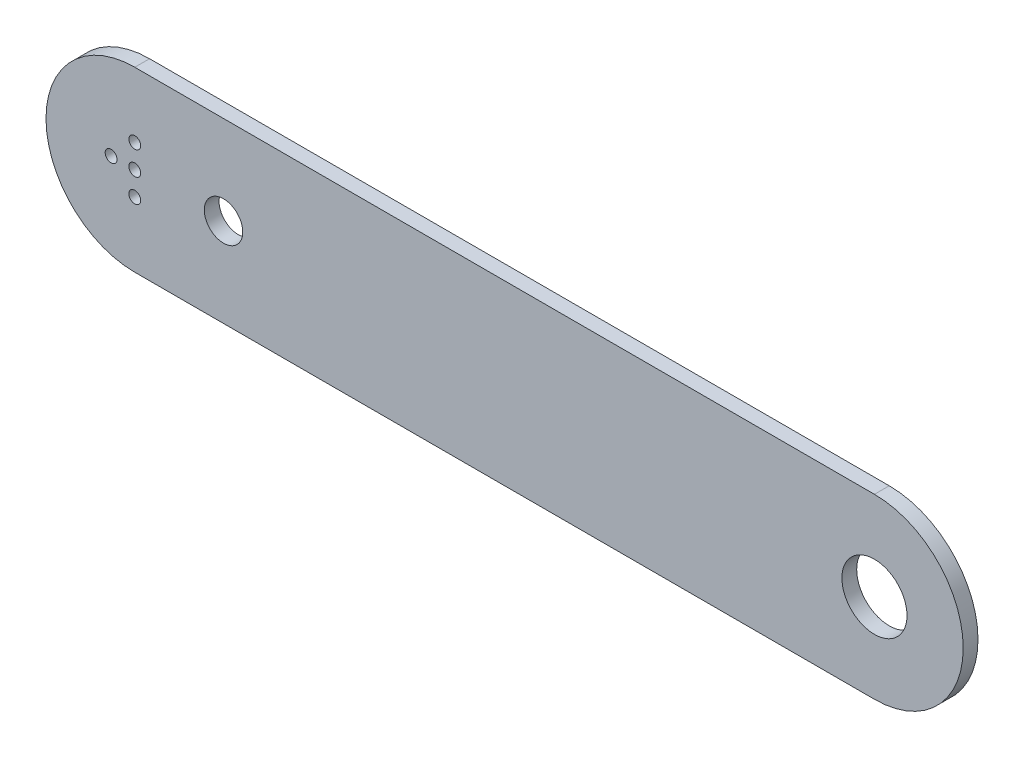
ISO-10303-21;
HEADER;
FILE_DESCRIPTION(('STEP AP214'),'2;1');
FILE_NAME('part.step','',(''),(''),'','','');
FILE_SCHEMA(('AUTOMOTIVE_DESIGN { 1 0 10303 214 1 1 1 1 }'));
ENDSEC;
DATA;
#1=APPLICATION_CONTEXT('core data for automotive mechanical design processes');
#2=APPLICATION_PROTOCOL_DEFINITION('international standard','automotive_design',2000,#1);
#3=PRODUCT_CONTEXT('',#1,'mechanical');
#4=PRODUCT('Part','Part','',(#3));
#5=PRODUCT_RELATED_PRODUCT_CATEGORY('part','',(#4));
#6=PRODUCT_DEFINITION_FORMATION('','',#4);
#7=PRODUCT_DEFINITION_CONTEXT('part definition',#1,'design');
#8=PRODUCT_DEFINITION('design','',#6,#7);
#9=PRODUCT_DEFINITION_SHAPE('','',#8);
#10=(LENGTH_UNIT() NAMED_UNIT(*) SI_UNIT(.MILLI.,.METRE.));
#11=(NAMED_UNIT(*) PLANE_ANGLE_UNIT() SI_UNIT($,.RADIAN.));
#12=(NAMED_UNIT(*) SI_UNIT($,.STERADIAN.) SOLID_ANGLE_UNIT());
#13=UNCERTAINTY_MEASURE_WITH_UNIT(LENGTH_MEASURE(1.E-05),#10,'distance_accuracy_value','');
#14=(GEOMETRIC_REPRESENTATION_CONTEXT(3) GLOBAL_UNCERTAINTY_ASSIGNED_CONTEXT((#13)) GLOBAL_UNIT_ASSIGNED_CONTEXT((#10,
#11,#12)) REPRESENTATION_CONTEXT('',''));
#15=CARTESIAN_POINT('',(0.,0.,0.));
#16=DIRECTION('',(0.,0.,1.));
#17=DIRECTION('',(1.,0.,0.));
#18=AXIS2_PLACEMENT_3D('',#15,#16,#17);
#19=CARTESIAN_POINT('',(370.,30.,5.));
#20=DIRECTION('',(0.,0.,-1.));
#21=DIRECTION('',(-1.,0.,0.));
#22=AXIS2_PLACEMENT_3D('',#19,#20,#21);
#23=CYLINDRICAL_SURFACE('',#22,30.);
#24=CARTESIAN_POINT('',(370.,30.,0.));
#25=DIRECTION('',(0.,0.,1.));
#26=DIRECTION('',(-1.,0.,0.));
#27=AXIS2_PLACEMENT_3D('',#24,#25,#26);
#28=CIRCLE('',#27,30.);
#29=CARTESIAN_POINT('',(370.,0.,0.));
#30=VERTEX_POINT('',#29);
#31=CARTESIAN_POINT('',(370.,60.,0.));
#32=VERTEX_POINT('',#31);
#33=EDGE_CURVE('E103',#30,#32,#28,.T.);
#34=ORIENTED_EDGE('',*,*,#33,.T.);
#35=DIRECTION('',(0.,0.,-1.));
#36=VECTOR('',#35,1.);
#37=CARTESIAN_POINT('',(370.,60.,5.));
#38=LINE('',#37,#36);
#39=CARTESIAN_POINT('',(370.,60.,5.));
#40=VERTEX_POINT('',#39);
#41=EDGE_CURVE('E11',#40,#32,#38,.T.);
#42=ORIENTED_EDGE('',*,*,#41,.F.);
#43=CARTESIAN_POINT('',(370.,30.,5.));
#44=DIRECTION('',(0.,0.,1.));
#45=DIRECTION('',(-1.,0.,0.));
#46=AXIS2_PLACEMENT_3D('',#43,#44,#45);
#47=CIRCLE('',#46,30.);
#48=CARTESIAN_POINT('',(370.,0.,5.));
#49=VERTEX_POINT('',#48);
#50=EDGE_CURVE('E90',#49,#40,#47,.T.);
#51=ORIENTED_EDGE('',*,*,#50,.F.);
#52=DIRECTION('',(0.,0.,-1.));
#53=VECTOR('',#52,1.);
#54=CARTESIAN_POINT('',(370.,0.,5.));
#55=LINE('',#54,#53);
#56=EDGE_CURVE('E99',#49,#30,#55,.T.);
#57=ORIENTED_EDGE('',*,*,#56,.T.);
#58=EDGE_LOOP('',(#34,#42,#51,#57));
#59=FACE_BOUND('',#58,.T.);
#60=ADVANCED_FACE('F37',(#59),#23,.T.);
#61=CARTESIAN_POINT('',(120.,60.,5.));
#62=DIRECTION('',(0.,-1.,0.));
#63=DIRECTION('',(0.,0.,-1.));
#64=AXIS2_PLACEMENT_3D('',#61,#62,#63);
#65=PLANE('',#64);
#66=DIRECTION('',(-1.,0.,0.));
#67=VECTOR('',#66,1.);
#68=CARTESIAN_POINT('',(120.,60.,0.));
#69=LINE('',#68,#67);
#70=CARTESIAN_POINT('',(120.,60.,0.));
#71=VERTEX_POINT('',#70);
#72=EDGE_CURVE('E94',#32,#71,#69,.T.);
#73=ORIENTED_EDGE('',*,*,#72,.T.);
#74=DIRECTION('',(0.,0.,-1.));
#75=VECTOR('',#74,1.);
#76=CARTESIAN_POINT('',(120.,60.,5.));
#77=LINE('',#76,#75);
#78=CARTESIAN_POINT('',(120.,60.,5.));
#79=VERTEX_POINT('',#78);
#80=EDGE_CURVE('E46',#79,#71,#77,.T.);
#81=ORIENTED_EDGE('',*,*,#80,.F.);
#82=DIRECTION('',(-1.,0.,0.));
#83=VECTOR('',#82,1.);
#84=CARTESIAN_POINT('',(120.,60.,5.));
#85=LINE('',#84,#83);
#86=EDGE_CURVE('E85',#40,#79,#85,.T.);
#87=ORIENTED_EDGE('',*,*,#86,.F.);
#88=ORIENTED_EDGE('',*,*,#41,.T.);
#89=EDGE_LOOP('',(#73,#81,#87,#88));
#90=FACE_BOUND('',#89,.T.);
#91=ADVANCED_FACE('F93',(#90),#65,.F.);
#92=CARTESIAN_POINT('',(120.,30.,5.));
#93=DIRECTION('',(0.,0.,-1.));
#94=DIRECTION('',(-1.,0.,0.));
#95=AXIS2_PLACEMENT_3D('',#92,#93,#94);
#96=CYLINDRICAL_SURFACE('',#95,30.);
#97=CARTESIAN_POINT('',(120.,30.,0.));
#98=DIRECTION('',(0.,0.,1.));
#99=DIRECTION('',(1.,0.,0.));
#100=AXIS2_PLACEMENT_3D('',#97,#98,#99);
#101=CIRCLE('',#100,30.);
#102=CARTESIAN_POINT('',(120.,0.,0.));
#103=VERTEX_POINT('',#102);
#104=EDGE_CURVE('E72',#71,#103,#101,.T.);
#105=ORIENTED_EDGE('',*,*,#104,.T.);
#106=DIRECTION('',(0.,0.,-1.));
#107=VECTOR('',#106,1.);
#108=CARTESIAN_POINT('',(120.,0.,5.));
#109=LINE('',#108,#107);
#110=CARTESIAN_POINT('',(120.,0.,5.));
#111=VERTEX_POINT('',#110);
#112=EDGE_CURVE('E95',#111,#103,#109,.T.);
#113=ORIENTED_EDGE('',*,*,#112,.F.);
#114=CARTESIAN_POINT('',(120.,30.,5.));
#115=DIRECTION('',(0.,0.,1.));
#116=DIRECTION('',(1.,0.,0.));
#117=AXIS2_PLACEMENT_3D('',#114,#115,#116);
#118=CIRCLE('',#117,30.);
#119=EDGE_CURVE('E88',#79,#111,#118,.T.);
#120=ORIENTED_EDGE('',*,*,#119,.F.);
#121=ORIENTED_EDGE('',*,*,#80,.T.);
#122=EDGE_LOOP('',(#105,#113,#120,#121));
#123=FACE_BOUND('',#122,.T.);
#124=ADVANCED_FACE('F97',(#123),#96,.T.);
#125=CARTESIAN_POINT('',(120.,0.,5.));
#126=DIRECTION('',(0.,1.,0.));
#127=DIRECTION('',(0.,0.,1.));
#128=AXIS2_PLACEMENT_3D('',#125,#126,#127);
#129=PLANE('',#128);
#130=DIRECTION('',(1.,0.,0.));
#131=VECTOR('',#130,1.);
#132=CARTESIAN_POINT('',(120.,0.,0.));
#133=LINE('',#132,#131);
#134=EDGE_CURVE('E78',#103,#30,#133,.T.);
#135=ORIENTED_EDGE('',*,*,#134,.T.);
#136=ORIENTED_EDGE('',*,*,#56,.F.);
#137=DIRECTION('',(1.,0.,0.));
#138=VECTOR('',#137,1.);
#139=CARTESIAN_POINT('',(120.,0.,5.));
#140=LINE('',#139,#138);
#141=EDGE_CURVE('E55',#111,#49,#140,.T.);
#142=ORIENTED_EDGE('',*,*,#141,.F.);
#143=ORIENTED_EDGE('',*,*,#112,.T.);
#144=EDGE_LOOP('',(#135,#136,#142,#143));
#145=FACE_BOUND('',#144,.T.);
#146=ADVANCED_FACE('F149',(#145),#129,.F.);
#147=CARTESIAN_POINT('',(370.,30.,5.));
#148=DIRECTION('',(0.,0.,-1.));
#149=DIRECTION('',(-1.,0.,0.));
#150=AXIS2_PLACEMENT_3D('',#147,#148,#149);
#151=PLANE('',#150);
#152=CARTESIAN_POINT('',(370.,30.,5.));
#153=DIRECTION('',(0.,0.,1.));
#154=DIRECTION('',(1.,0.,0.));
#155=AXIS2_PLACEMENT_3D('',#152,#153,#154);
#156=CIRCLE('',#155,11.);
#157=CARTESIAN_POINT('',(381.,30.,5.));
#158=VERTEX_POINT('',#157);
#159=EDGE_CURVE('E115',#158,#158,#156,.T.);
#160=ORIENTED_EDGE('',*,*,#159,.F.);
#161=EDGE_LOOP('',(#160));
#162=FACE_BOUND('',#161,.T.);
#163=CARTESIAN_POINT('',(120.,38.,5.));
#164=DIRECTION('',(0.,0.,1.));
#165=DIRECTION('',(1.,0.,0.));
#166=AXIS2_PLACEMENT_3D('',#163,#164,#165);
#167=CIRCLE('',#166,2.);
#168=CARTESIAN_POINT('',(122.,38.,5.));
#169=VERTEX_POINT('',#168);
#170=EDGE_CURVE('E278',#169,#169,#167,.T.);
#171=ORIENTED_EDGE('',*,*,#170,.F.);
#172=EDGE_LOOP('',(#171));
#173=FACE_BOUND('',#172,.T.);
#174=CARTESIAN_POINT('',(120.,22.,5.));
#175=DIRECTION('',(0.,0.,1.));
#176=DIRECTION('',(1.,0.,0.));
#177=AXIS2_PLACEMENT_3D('',#174,#175,#176);
#178=CIRCLE('',#177,2.);
#179=CARTESIAN_POINT('',(122.,22.,5.));
#180=VERTEX_POINT('',#179);
#181=EDGE_CURVE('E280',#180,#180,#178,.T.);
#182=ORIENTED_EDGE('',*,*,#181,.F.);
#183=EDGE_LOOP('',(#182));
#184=FACE_BOUND('',#183,.T.);
#185=CARTESIAN_POINT('',(120.,30.,5.));
#186=DIRECTION('',(0.,0.,1.));
#187=DIRECTION('',(1.,0.,0.));
#188=AXIS2_PLACEMENT_3D('',#185,#186,#187);
#189=CIRCLE('',#188,2.);
#190=CARTESIAN_POINT('',(122.,30.,5.));
#191=VERTEX_POINT('',#190);
#192=EDGE_CURVE('E284',#191,#191,#189,.T.);
#193=ORIENTED_EDGE('',*,*,#192,.F.);
#194=EDGE_LOOP('',(#193));
#195=FACE_BOUND('',#194,.T.);
#196=CARTESIAN_POINT('',(150.,30.,5.));
#197=DIRECTION('',(0.,0.,1.));
#198=DIRECTION('',(1.,0.,0.));
#199=AXIS2_PLACEMENT_3D('',#196,#197,#198);
#200=CIRCLE('',#199,6.50000000000002);
#201=CARTESIAN_POINT('',(156.5,30.,5.));
#202=VERTEX_POINT('',#201);
#203=EDGE_CURVE('E290',#202,#202,#200,.T.);
#204=ORIENTED_EDGE('',*,*,#203,.F.);
#205=EDGE_LOOP('',(#204));
#206=FACE_BOUND('',#205,.T.);
#207=CARTESIAN_POINT('',(112.,30.,5.));
#208=DIRECTION('',(0.,0.,1.));
#209=DIRECTION('',(1.,0.,0.));
#210=AXIS2_PLACEMENT_3D('',#207,#208,#209);
#211=CIRCLE('',#210,2.);
#212=CARTESIAN_POINT('',(114.,30.,5.));
#213=VERTEX_POINT('',#212);
#214=EDGE_CURVE('E281',#213,#213,#211,.T.);
#215=ORIENTED_EDGE('',*,*,#214,.F.);
#216=EDGE_LOOP('',(#215));
#217=FACE_BOUND('',#216,.T.);
#218=ORIENTED_EDGE('',*,*,#50,.T.);
#219=ORIENTED_EDGE('',*,*,#86,.T.);
#220=ORIENTED_EDGE('',*,*,#119,.T.);
#221=ORIENTED_EDGE('',*,*,#141,.T.);
#222=EDGE_LOOP('',(#218,#219,#220,#221));
#223=FACE_BOUND('',#222,.T.);
#224=ADVANCED_FACE('F86',(#162,#173,#184,#195,#206,#217,#223),#151,.F.);
#225=CARTESIAN_POINT('',(370.,30.,0.));
#226=DIRECTION('',(0.,0.,-1.));
#227=DIRECTION('',(-1.,0.,0.));
#228=AXIS2_PLACEMENT_3D('',#225,#226,#227);
#229=PLANE('',#228);
#230=CARTESIAN_POINT('',(370.,30.,0.));
#231=DIRECTION('',(0.,0.,-1.));
#232=DIRECTION('',(-1.,0.,0.));
#233=AXIS2_PLACEMENT_3D('',#230,#231,#232);
#234=CIRCLE('',#233,11.);
#235=CARTESIAN_POINT('',(359.,30.,0.));
#236=VERTEX_POINT('',#235);
#237=EDGE_CURVE('E40',#236,#236,#234,.T.);
#238=ORIENTED_EDGE('',*,*,#237,.F.);
#239=EDGE_LOOP('',(#238));
#240=FACE_BOUND('',#239,.T.);
#241=CARTESIAN_POINT('',(120.,38.,0.));
#242=DIRECTION('',(0.,0.,-1.));
#243=DIRECTION('',(-1.,0.,0.));
#244=AXIS2_PLACEMENT_3D('',#241,#242,#243);
#245=CIRCLE('',#244,2.);
#246=CARTESIAN_POINT('',(118.,38.,0.));
#247=VERTEX_POINT('',#246);
#248=EDGE_CURVE('E123',#247,#247,#245,.T.);
#249=ORIENTED_EDGE('',*,*,#248,.F.);
#250=EDGE_LOOP('',(#249));
#251=FACE_BOUND('',#250,.T.);
#252=CARTESIAN_POINT('',(120.,22.,0.));
#253=DIRECTION('',(0.,0.,-1.));
#254=DIRECTION('',(-1.,0.,0.));
#255=AXIS2_PLACEMENT_3D('',#252,#253,#254);
#256=CIRCLE('',#255,2.);
#257=CARTESIAN_POINT('',(118.,22.,0.));
#258=VERTEX_POINT('',#257);
#259=EDGE_CURVE('E121',#258,#258,#256,.T.);
#260=ORIENTED_EDGE('',*,*,#259,.F.);
#261=EDGE_LOOP('',(#260));
#262=FACE_BOUND('',#261,.T.);
#263=CARTESIAN_POINT('',(120.,30.,0.));
#264=DIRECTION('',(0.,0.,-1.));
#265=DIRECTION('',(-1.,0.,0.));
#266=AXIS2_PLACEMENT_3D('',#263,#264,#265);
#267=CIRCLE('',#266,2.);
#268=CARTESIAN_POINT('',(118.,30.,0.));
#269=VERTEX_POINT('',#268);
#270=EDGE_CURVE('E118',#269,#269,#267,.T.);
#271=ORIENTED_EDGE('',*,*,#270,.F.);
#272=EDGE_LOOP('',(#271));
#273=FACE_BOUND('',#272,.T.);
#274=CARTESIAN_POINT('',(150.,30.,0.));
#275=DIRECTION('',(0.,0.,-1.));
#276=DIRECTION('',(-1.,0.,0.));
#277=AXIS2_PLACEMENT_3D('',#274,#275,#276);
#278=CIRCLE('',#277,6.50000000000002);
#279=CARTESIAN_POINT('',(143.5,30.,0.));
#280=VERTEX_POINT('',#279);
#281=EDGE_CURVE('E114',#280,#280,#278,.T.);
#282=ORIENTED_EDGE('',*,*,#281,.F.);
#283=EDGE_LOOP('',(#282));
#284=FACE_BOUND('',#283,.T.);
#285=CARTESIAN_POINT('',(112.,30.,0.));
#286=DIRECTION('',(0.,0.,-1.));
#287=DIRECTION('',(-1.,0.,0.));
#288=AXIS2_PLACEMENT_3D('',#285,#286,#287);
#289=CIRCLE('',#288,2.);
#290=CARTESIAN_POINT('',(110.,30.,0.));
#291=VERTEX_POINT('',#290);
#292=EDGE_CURVE('E111',#291,#291,#289,.T.);
#293=ORIENTED_EDGE('',*,*,#292,.F.);
#294=EDGE_LOOP('',(#293));
#295=FACE_BOUND('',#294,.T.);
#296=ORIENTED_EDGE('',*,*,#33,.F.);
#297=ORIENTED_EDGE('',*,*,#134,.F.);
#298=ORIENTED_EDGE('',*,*,#104,.F.);
#299=ORIENTED_EDGE('',*,*,#72,.F.);
#300=EDGE_LOOP('',(#296,#297,#298,#299));
#301=FACE_BOUND('',#300,.T.);
#302=ADVANCED_FACE('F133',(#240,#251,#262,#273,#284,#295,#301),#229,.T.);
#303=CARTESIAN_POINT('',(112.,30.,-215.));
#304=DIRECTION('',(0.,0.,1.));
#305=DIRECTION('',(1.,0.,0.));
#306=AXIS2_PLACEMENT_3D('',#303,#304,#305);
#307=CYLINDRICAL_SURFACE('',#306,2.);
#308=ORIENTED_EDGE('',*,*,#292,.T.);
#309=EDGE_LOOP('',(#308));
#310=FACE_BOUND('',#309,.T.);
#311=ORIENTED_EDGE('',*,*,#214,.T.);
#312=EDGE_LOOP('',(#311));
#313=FACE_BOUND('',#312,.T.);
#314=ADVANCED_FACE('F136',(#310,#313),#307,.F.);
#315=CARTESIAN_POINT('',(150.,30.,-215.));
#316=DIRECTION('',(0.,0.,1.));
#317=DIRECTION('',(1.,0.,0.));
#318=AXIS2_PLACEMENT_3D('',#315,#316,#317);
#319=CYLINDRICAL_SURFACE('',#318,6.50000000000002);
#320=ORIENTED_EDGE('',*,*,#281,.T.);
#321=EDGE_LOOP('',(#320));
#322=FACE_BOUND('',#321,.T.);
#323=ORIENTED_EDGE('',*,*,#203,.T.);
#324=EDGE_LOOP('',(#323));
#325=FACE_BOUND('',#324,.T.);
#326=ADVANCED_FACE('F198',(#322,#325),#319,.F.);
#327=CARTESIAN_POINT('',(120.,30.,-215.));
#328=DIRECTION('',(0.,0.,1.));
#329=DIRECTION('',(1.,0.,0.));
#330=AXIS2_PLACEMENT_3D('',#327,#328,#329);
#331=CYLINDRICAL_SURFACE('',#330,2.);
#332=ORIENTED_EDGE('',*,*,#270,.T.);
#333=EDGE_LOOP('',(#332));
#334=FACE_BOUND('',#333,.T.);
#335=ORIENTED_EDGE('',*,*,#192,.T.);
#336=EDGE_LOOP('',(#335));
#337=FACE_BOUND('',#336,.T.);
#338=ADVANCED_FACE('F209',(#334,#337),#331,.F.);
#339=CARTESIAN_POINT('',(120.,22.,-215.));
#340=DIRECTION('',(0.,0.,1.));
#341=DIRECTION('',(1.,0.,0.));
#342=AXIS2_PLACEMENT_3D('',#339,#340,#341);
#343=CYLINDRICAL_SURFACE('',#342,2.);
#344=ORIENTED_EDGE('',*,*,#259,.T.);
#345=EDGE_LOOP('',(#344));
#346=FACE_BOUND('',#345,.T.);
#347=ORIENTED_EDGE('',*,*,#181,.T.);
#348=EDGE_LOOP('',(#347));
#349=FACE_BOUND('',#348,.T.);
#350=ADVANCED_FACE('F220',(#346,#349),#343,.F.);
#351=CARTESIAN_POINT('',(120.,38.,-215.));
#352=DIRECTION('',(0.,0.,1.));
#353=DIRECTION('',(1.,0.,0.));
#354=AXIS2_PLACEMENT_3D('',#351,#352,#353);
#355=CYLINDRICAL_SURFACE('',#354,2.);
#356=ORIENTED_EDGE('',*,*,#248,.T.);
#357=EDGE_LOOP('',(#356));
#358=FACE_BOUND('',#357,.T.);
#359=ORIENTED_EDGE('',*,*,#170,.T.);
#360=EDGE_LOOP('',(#359));
#361=FACE_BOUND('',#360,.T.);
#362=ADVANCED_FACE('F231',(#358,#361),#355,.F.);
#363=CARTESIAN_POINT('',(370.,30.,-215.));
#364=DIRECTION('',(0.,0.,1.));
#365=DIRECTION('',(1.,0.,0.));
#366=AXIS2_PLACEMENT_3D('',#363,#364,#365);
#367=CYLINDRICAL_SURFACE('',#366,11.);
#368=ORIENTED_EDGE('',*,*,#237,.T.);
#369=EDGE_LOOP('',(#368));
#370=FACE_BOUND('',#369,.T.);
#371=ORIENTED_EDGE('',*,*,#159,.T.);
#372=EDGE_LOOP('',(#371));
#373=FACE_BOUND('',#372,.T.);
#374=ADVANCED_FACE('F130',(#370,#373),#367,.F.);
#375=CLOSED_SHELL('',(#60,#91,#124,#146,#224,#302,#314,#326,#338,#350,#362,#374));
#376=MANIFOLD_SOLID_BREP('B2',#375);
#377=ADVANCED_BREP_SHAPE_REPRESENTATION('',(#18,#376),#14);
#378=SHAPE_DEFINITION_REPRESENTATION(#9,#377);
ENDSEC;
END-ISO-10303-21;
